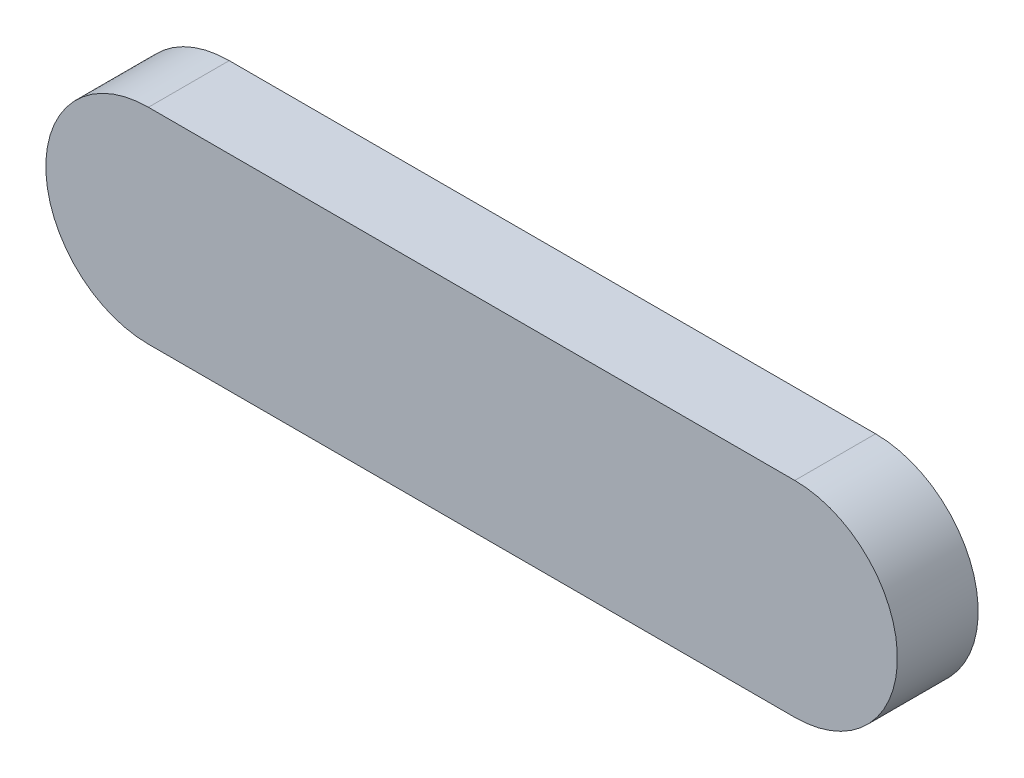
ISO-10303-21;
HEADER;
FILE_DESCRIPTION(('STEP AP214'),'2;1');
FILE_NAME('part.step','',(''),(''),'','','');
FILE_SCHEMA(('AUTOMOTIVE_DESIGN { 1 0 10303 214 1 1 1 1 }'));
ENDSEC;
DATA;
#1=APPLICATION_CONTEXT('core data for automotive mechanical design processes');
#2=APPLICATION_PROTOCOL_DEFINITION('international standard','automotive_design',2000,#1);
#3=PRODUCT_CONTEXT('',#1,'mechanical');
#4=PRODUCT('Part','Part','',(#3));
#5=PRODUCT_RELATED_PRODUCT_CATEGORY('part','',(#4));
#6=PRODUCT_DEFINITION_FORMATION('','',#4);
#7=PRODUCT_DEFINITION_CONTEXT('part definition',#1,'design');
#8=PRODUCT_DEFINITION('design','',#6,#7);
#9=PRODUCT_DEFINITION_SHAPE('','',#8);
#10=(LENGTH_UNIT() NAMED_UNIT(*) SI_UNIT(.MILLI.,.METRE.));
#11=(NAMED_UNIT(*) PLANE_ANGLE_UNIT() SI_UNIT($,.RADIAN.));
#12=(NAMED_UNIT(*) SI_UNIT($,.STERADIAN.) SOLID_ANGLE_UNIT());
#13=UNCERTAINTY_MEASURE_WITH_UNIT(LENGTH_MEASURE(1.E-05),#10,'distance_accuracy_value','');
#14=(GEOMETRIC_REPRESENTATION_CONTEXT(3) GLOBAL_UNCERTAINTY_ASSIGNED_CONTEXT((#13)) GLOBAL_UNIT_ASSIGNED_CONTEXT((#10,
#11,#12)) REPRESENTATION_CONTEXT('',''));
#15=CARTESIAN_POINT('',(0.,0.,0.));
#16=DIRECTION('',(0.,0.,1.));
#17=DIRECTION('',(1.,0.,0.));
#18=AXIS2_PLACEMENT_3D('',#15,#16,#17);
#19=CARTESIAN_POINT('',(128.1684,118.6434,0.));
#20=DIRECTION('',(0.,1.,0.));
#21=DIRECTION('',(1.,0.,0.));
#22=AXIS2_PLACEMENT_3D('',#19,#20,#21);
#23=PLANE('',#22);
#24=DIRECTION('',(1.,0.,0.));
#25=VECTOR('',#24,1.);
#26=CARTESIAN_POINT('',(128.1684,118.6434,0.1999996));
#27=LINE('',#26,#25);
#28=CARTESIAN_POINT('',(128.1684,118.6434,0.1999996));
#29=VERTEX_POINT('',#28);
#30=CARTESIAN_POINT('',(129.7686,118.6434,0.1999996));
#31=VERTEX_POINT('',#30);
#32=EDGE_CURVE('E11',#29,#31,#27,.T.);
#33=ORIENTED_EDGE('',*,*,#32,.F.);
#34=DIRECTION('',(0.,0.,1.));
#35=VECTOR('',#34,1.);
#36=CARTESIAN_POINT('',(128.1684,118.6434,0.));
#37=LINE('',#36,#35);
#38=CARTESIAN_POINT('',(128.1684,118.6434,0.));
#39=VERTEX_POINT('',#38);
#40=EDGE_CURVE('E24',#39,#29,#37,.T.);
#41=ORIENTED_EDGE('',*,*,#40,.F.);
#42=DIRECTION('',(1.,0.,0.));
#43=VECTOR('',#42,1.);
#44=CARTESIAN_POINT('',(128.1684,118.6434,0.));
#45=LINE('',#44,#43);
#46=CARTESIAN_POINT('',(129.7686,118.6434,0.));
#47=VERTEX_POINT('',#46);
#48=EDGE_CURVE('E75',#39,#47,#45,.T.);
#49=ORIENTED_EDGE('',*,*,#48,.T.);
#50=DIRECTION('',(0.,0.,1.));
#51=VECTOR('',#50,1.);
#52=CARTESIAN_POINT('',(129.7686,118.6434,0.));
#53=LINE('',#52,#51);
#54=EDGE_CURVE('E37',#47,#31,#53,.T.);
#55=ORIENTED_EDGE('',*,*,#54,.T.);
#56=EDGE_LOOP('',(#33,#41,#49,#55));
#57=FACE_BOUND('',#56,.T.);
#58=ADVANCED_FACE('F17',(#57),#23,.F.);
#59=CARTESIAN_POINT('',(129.7686,118.8974,0.));
#60=DIRECTION('',(0.,0.,-1.));
#61=DIRECTION('',(-1.11896493820492E-13,-1.,0.));
#62=AXIS2_PLACEMENT_3D('',#59,#60,#61);
#63=CYLINDRICAL_SURFACE('',#62,0.253999999999995);
#64=CARTESIAN_POINT('',(129.7686,118.8974,0.1999996));
#65=DIRECTION('',(0.,0.,1.));
#66=DIRECTION('',(-1.11896493820492E-13,-1.,0.));
#67=AXIS2_PLACEMENT_3D('',#64,#65,#66);
#68=CIRCLE('',#67,0.253999999999995);
#69=CARTESIAN_POINT('',(129.7686,119.1514,0.1999996));
#70=VERTEX_POINT('',#69);
#71=EDGE_CURVE('E83',#31,#70,#68,.T.);
#72=ORIENTED_EDGE('',*,*,#71,.F.);
#73=ORIENTED_EDGE('',*,*,#54,.F.);
#74=CARTESIAN_POINT('',(129.7686,118.8974,0.));
#75=DIRECTION('',(0.,0.,1.));
#76=DIRECTION('',(-1.11896493820492E-13,-1.,0.));
#77=AXIS2_PLACEMENT_3D('',#74,#75,#76);
#78=CIRCLE('',#77,0.253999999999995);
#79=CARTESIAN_POINT('',(129.7686,119.1514,0.));
#80=VERTEX_POINT('',#79);
#81=EDGE_CURVE('E81',#47,#80,#78,.T.);
#82=ORIENTED_EDGE('',*,*,#81,.T.);
#83=DIRECTION('',(0.,0.,1.));
#84=VECTOR('',#83,1.);
#85=CARTESIAN_POINT('',(129.7686,119.1514,0.));
#86=LINE('',#85,#84);
#87=EDGE_CURVE('E67',#80,#70,#86,.T.);
#88=ORIENTED_EDGE('',*,*,#87,.T.);
#89=EDGE_LOOP('',(#72,#73,#82,#88));
#90=FACE_BOUND('',#89,.T.);
#91=ADVANCED_FACE('F89',(#90),#63,.T.);
#92=CARTESIAN_POINT('',(129.7686,119.1514,0.));
#93=DIRECTION('',(0.,-1.,0.));
#94=DIRECTION('',(-1.,0.,0.));
#95=AXIS2_PLACEMENT_3D('',#92,#93,#94);
#96=PLANE('',#95);
#97=DIRECTION('',(-1.,0.,0.));
#98=VECTOR('',#97,1.);
#99=CARTESIAN_POINT('',(129.7686,119.1514,0.1999996));
#100=LINE('',#99,#98);
#101=CARTESIAN_POINT('',(128.1684,119.1514,0.1999996));
#102=VERTEX_POINT('',#101);
#103=EDGE_CURVE('E71',#70,#102,#100,.T.);
#104=ORIENTED_EDGE('',*,*,#103,.F.);
#105=ORIENTED_EDGE('',*,*,#87,.F.);
#106=DIRECTION('',(-1.,0.,0.));
#107=VECTOR('',#106,1.);
#108=CARTESIAN_POINT('',(129.7686,119.1514,0.));
#109=LINE('',#108,#107);
#110=CARTESIAN_POINT('',(128.1684,119.1514,0.));
#111=VERTEX_POINT('',#110);
#112=EDGE_CURVE('E63',#80,#111,#109,.T.);
#113=ORIENTED_EDGE('',*,*,#112,.T.);
#114=DIRECTION('',(0.,0.,1.));
#115=VECTOR('',#114,1.);
#116=CARTESIAN_POINT('',(128.1684,119.1514,0.));
#117=LINE('',#116,#115);
#118=EDGE_CURVE('E53',#111,#102,#117,.T.);
#119=ORIENTED_EDGE('',*,*,#118,.T.);
#120=EDGE_LOOP('',(#104,#105,#113,#119));
#121=FACE_BOUND('',#120,.T.);
#122=ADVANCED_FACE('F66',(#121),#96,.F.);
#123=CARTESIAN_POINT('',(128.1684,118.8974,0.));
#124=DIRECTION('',(0.,0.,-1.));
#125=DIRECTION('',(-1.11896493820486E-13,1.,0.));
#126=AXIS2_PLACEMENT_3D('',#123,#124,#125);
#127=CYLINDRICAL_SURFACE('',#126,0.254000000000005);
#128=CARTESIAN_POINT('',(128.1684,118.8974,0.1999996));
#129=DIRECTION('',(0.,0.,1.));
#130=DIRECTION('',(-1.11896493820486E-13,1.,0.));
#131=AXIS2_PLACEMENT_3D('',#128,#129,#130);
#132=CIRCLE('',#131,0.254000000000005);
#133=EDGE_CURVE('E59',#102,#29,#132,.T.);
#134=ORIENTED_EDGE('',*,*,#133,.F.);
#135=ORIENTED_EDGE('',*,*,#118,.F.);
#136=CARTESIAN_POINT('',(128.1684,118.8974,0.));
#137=DIRECTION('',(0.,0.,1.));
#138=DIRECTION('',(-1.11896493820486E-13,1.,0.));
#139=AXIS2_PLACEMENT_3D('',#136,#137,#138);
#140=CIRCLE('',#139,0.254000000000005);
#141=EDGE_CURVE('E57',#111,#39,#140,.T.);
#142=ORIENTED_EDGE('',*,*,#141,.T.);
#143=ORIENTED_EDGE('',*,*,#40,.T.);
#144=EDGE_LOOP('',(#134,#135,#142,#143));
#145=FACE_BOUND('',#144,.T.);
#146=ADVANCED_FACE('F55',(#145),#127,.T.);
#147=CARTESIAN_POINT('',(128.1684,118.6434,0.));
#148=DIRECTION('',(0.,0.,-1.));
#149=DIRECTION('',(-1.,0.,0.));
#150=AXIS2_PLACEMENT_3D('',#147,#148,#149);
#151=PLANE('',#150);
#152=ORIENTED_EDGE('',*,*,#141,.F.);
#153=ORIENTED_EDGE('',*,*,#112,.F.);
#154=ORIENTED_EDGE('',*,*,#81,.F.);
#155=ORIENTED_EDGE('',*,*,#48,.F.);
#156=EDGE_LOOP('',(#152,#153,#154,#155));
#157=FACE_BOUND('',#156,.T.);
#158=ADVANCED_FACE('F74',(#157),#151,.T.);
#159=CARTESIAN_POINT('',(128.1684,118.6434,0.1999996));
#160=DIRECTION('',(0.,0.,-1.));
#161=DIRECTION('',(-1.,0.,0.));
#162=AXIS2_PLACEMENT_3D('',#159,#160,#161);
#163=PLANE('',#162);
#164=ORIENTED_EDGE('',*,*,#32,.T.);
#165=ORIENTED_EDGE('',*,*,#71,.T.);
#166=ORIENTED_EDGE('',*,*,#103,.T.);
#167=ORIENTED_EDGE('',*,*,#133,.T.);
#168=EDGE_LOOP('',(#164,#165,#166,#167));
#169=FACE_BOUND('',#168,.T.);
#170=ADVANCED_FACE('F91',(#169),#163,.F.);
#171=CLOSED_SHELL('',(#58,#91,#122,#146,#158,#170));
#172=MANIFOLD_SOLID_BREP('B1',#171);
#173=ADVANCED_BREP_SHAPE_REPRESENTATION('',(#18,#172),#14);
#174=SHAPE_DEFINITION_REPRESENTATION(#9,#173);
ENDSEC;
END-ISO-10303-21;
